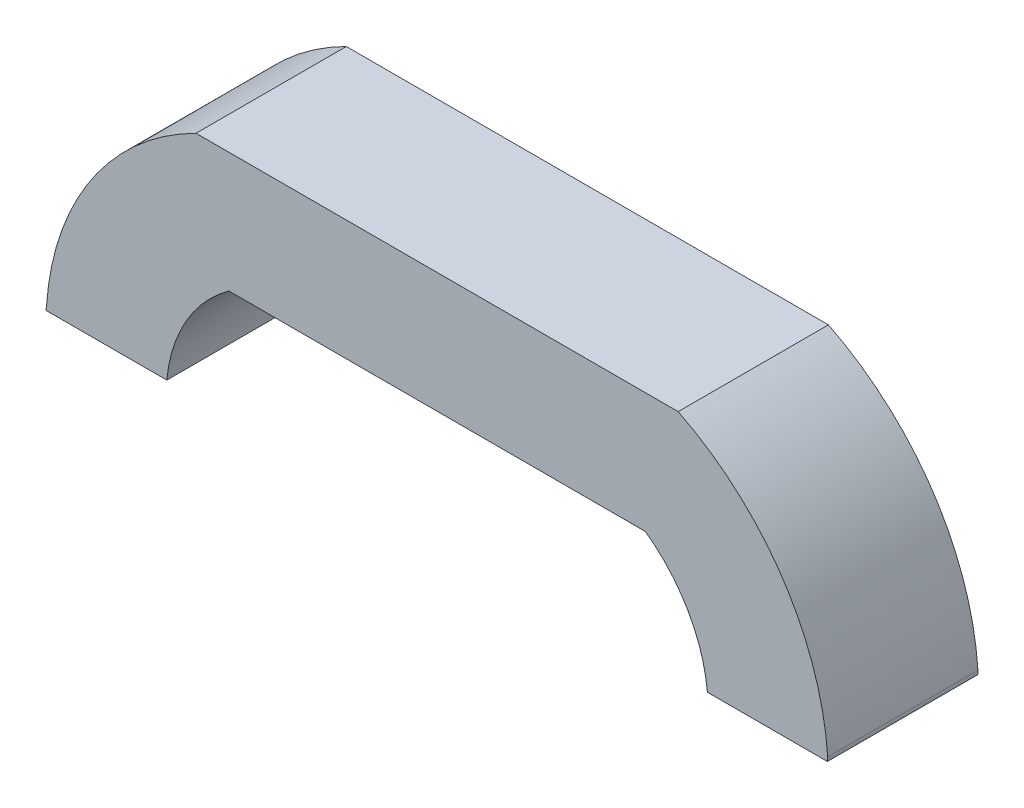
ISO-10303-21;
HEADER;
FILE_DESCRIPTION(('STEP AP214'),'2;1');
FILE_NAME('part.step','',(''),(''),'','','');
FILE_SCHEMA(('AUTOMOTIVE_DESIGN { 1 0 10303 214 1 1 1 1 }'));
ENDSEC;
DATA;
#1=APPLICATION_CONTEXT('core data for automotive mechanical design processes');
#2=APPLICATION_PROTOCOL_DEFINITION('international standard','automotive_design',2000,#1);
#3=PRODUCT_CONTEXT('',#1,'mechanical');
#4=PRODUCT('Part','Part','',(#3));
#5=PRODUCT_RELATED_PRODUCT_CATEGORY('part','',(#4));
#6=PRODUCT_DEFINITION_FORMATION('','',#4);
#7=PRODUCT_DEFINITION_CONTEXT('part definition',#1,'design');
#8=PRODUCT_DEFINITION('design','',#6,#7);
#9=PRODUCT_DEFINITION_SHAPE('','',#8);
#10=(LENGTH_UNIT() NAMED_UNIT(*) SI_UNIT(.MILLI.,.METRE.));
#11=(NAMED_UNIT(*) PLANE_ANGLE_UNIT() SI_UNIT($,.RADIAN.));
#12=(NAMED_UNIT(*) SI_UNIT($,.STERADIAN.) SOLID_ANGLE_UNIT());
#13=UNCERTAINTY_MEASURE_WITH_UNIT(LENGTH_MEASURE(1.E-05),#10,'distance_accuracy_value','');
#14=(GEOMETRIC_REPRESENTATION_CONTEXT(3) GLOBAL_UNCERTAINTY_ASSIGNED_CONTEXT((#13)) GLOBAL_UNIT_ASSIGNED_CONTEXT((#10,
#11,#12)) REPRESENTATION_CONTEXT('',''));
#15=CARTESIAN_POINT('',(0.,0.,0.));
#16=DIRECTION('',(0.,0.,1.));
#17=DIRECTION('',(1.,0.,0.));
#18=AXIS2_PLACEMENT_3D('',#15,#16,#17);
#19=CARTESIAN_POINT('',(63.0298841219028,0.472457439636551,25.));
#20=DIRECTION('',(0.,0.,-1.));
#21=DIRECTION('',(-1.,0.,0.));
#22=AXIS2_PLACEMENT_3D('',#19,#20,#21);
#23=CYLINDRICAL_SURFACE('',#22,1.95791401243348);
#24=CARTESIAN_POINT('',(63.0298841219028,0.472457439636551,0.));
#25=DIRECTION('',(0.,0.,1.));
#26=DIRECTION('',(1.,0.,0.));
#27=AXIS2_PLACEMENT_3D('',#24,#25,#26);
#28=CIRCLE('',#27,1.95791401243348);
#29=CARTESIAN_POINT('',(64.9770075097149,0.677732359484106,0.));
#30=VERTEX_POINT('',#29);
#31=CARTESIAN_POINT('',(64.92993971262,0.,0.));
#32=VERTEX_POINT('',#31);
#33=EDGE_CURVE('E144',#30,#32,#28,.F.);
#34=ORIENTED_EDGE('',*,*,#33,.F.);
#35=DIRECTION('',(0.,0.,-1.));
#36=VECTOR('',#35,1.);
#37=CARTESIAN_POINT('',(64.9770075097149,0.677732359484106,25.));
#38=LINE('',#37,#36);
#39=CARTESIAN_POINT('',(64.9770075097149,0.677732359484106,25.));
#40=VERTEX_POINT('',#39);
#41=EDGE_CURVE('E11',#40,#30,#38,.T.);
#42=ORIENTED_EDGE('',*,*,#41,.F.);
#43=CARTESIAN_POINT('',(63.0298841219028,0.472457439636551,25.));
#44=DIRECTION('',(0.,0.,1.));
#45=DIRECTION('',(1.,0.,0.));
#46=AXIS2_PLACEMENT_3D('',#43,#44,#45);
#47=CIRCLE('',#46,1.95791401243348);
#48=CARTESIAN_POINT('',(64.92993971262,0.,25.));
#49=VERTEX_POINT('',#48);
#50=EDGE_CURVE('E168',#40,#49,#47,.F.);
#51=ORIENTED_EDGE('',*,*,#50,.T.);
#52=DIRECTION('',(0.,0.,-1.));
#53=VECTOR('',#52,1.);
#54=CARTESIAN_POINT('',(64.92993971262,0.,25.));
#55=LINE('',#54,#53);
#56=EDGE_CURVE('E98',#49,#32,#55,.T.);
#57=ORIENTED_EDGE('',*,*,#56,.T.);
#58=EDGE_LOOP('',(#34,#42,#51,#57));
#59=FACE_BOUND('',#58,.T.);
#60=ADVANCED_FACE('F41',(#59),#23,.T.);
#61=CARTESIAN_POINT('',(19.9479785108818,-2.38106358097612,25.));
#62=DIRECTION('',(0.,0.,-1.));
#63=DIRECTION('',(-1.,0.,0.));
#64=AXIS2_PLACEMENT_3D('',#61,#62,#63);
#65=CYLINDRICAL_SURFACE('',#64,45.1328005466438);
#66=CARTESIAN_POINT('',(19.9479785108818,-2.38106358097612,0.));
#67=DIRECTION('',(0.,0.,1.));
#68=DIRECTION('',(1.,0.,0.));
#69=AXIS2_PLACEMENT_3D('',#66,#67,#68);
#70=CIRCLE('',#69,45.1328005466438);
#71=CARTESIAN_POINT('',(40.1058402340978,38.,0.));
#72=VERTEX_POINT('',#71);
#73=EDGE_CURVE('E147',#72,#30,#70,.F.);
#74=ORIENTED_EDGE('',*,*,#73,.F.);
#75=DIRECTION('',(0.,0.,-1.));
#76=VECTOR('',#75,1.);
#77=CARTESIAN_POINT('',(40.1058402340978,38.,25.));
#78=LINE('',#77,#76);
#79=CARTESIAN_POINT('',(40.1058402340978,38.,25.));
#80=VERTEX_POINT('',#79);
#81=EDGE_CURVE('E49',#80,#72,#78,.T.);
#82=ORIENTED_EDGE('',*,*,#81,.F.);
#83=CARTESIAN_POINT('',(19.9479785108818,-2.38106358097612,25.));
#84=DIRECTION('',(0.,0.,1.));
#85=DIRECTION('',(1.,0.,0.));
#86=AXIS2_PLACEMENT_3D('',#83,#84,#85);
#87=CIRCLE('',#86,45.1328005466438);
#88=EDGE_CURVE('E220',#80,#40,#87,.F.);
#89=ORIENTED_EDGE('',*,*,#88,.T.);
#90=ORIENTED_EDGE('',*,*,#41,.T.);
#91=EDGE_LOOP('',(#74,#82,#89,#90));
#92=FACE_BOUND('',#91,.T.);
#93=ADVANCED_FACE('F191',(#92),#65,.T.);
#94=CARTESIAN_POINT('',(0.,38.,25.));
#95=DIRECTION('',(0.,1.,0.));
#96=DIRECTION('',(0.,0.,1.));
#97=AXIS2_PLACEMENT_3D('',#94,#95,#96);
#98=PLANE('',#97);
#99=DIRECTION('',(1.,0.,0.));
#100=VECTOR('',#99,1.);
#101=CARTESIAN_POINT('',(0.,38.,0.));
#102=LINE('',#101,#100);
#103=CARTESIAN_POINT('',(-40.1058402340978,38.,0.));
#104=VERTEX_POINT('',#103);
#105=EDGE_CURVE('E151',#104,#72,#102,.T.);
#106=ORIENTED_EDGE('',*,*,#105,.F.);
#107=DIRECTION('',(0.,0.,-1.));
#108=VECTOR('',#107,1.);
#109=CARTESIAN_POINT('',(-40.1058402340978,38.,25.));
#110=LINE('',#109,#108);
#111=CARTESIAN_POINT('',(-40.1058402340978,38.,25.));
#112=VERTEX_POINT('',#111);
#113=EDGE_CURVE('E180',#112,#104,#110,.T.);
#114=ORIENTED_EDGE('',*,*,#113,.F.);
#115=DIRECTION('',(1.,0.,0.));
#116=VECTOR('',#115,1.);
#117=CARTESIAN_POINT('',(0.,38.,25.));
#118=LINE('',#117,#116);
#119=EDGE_CURVE('E187',#112,#80,#118,.T.);
#120=ORIENTED_EDGE('',*,*,#119,.T.);
#121=ORIENTED_EDGE('',*,*,#81,.T.);
#122=EDGE_LOOP('',(#106,#114,#120,#121));
#123=FACE_BOUND('',#122,.T.);
#124=ADVANCED_FACE('F185',(#123),#98,.T.);
#125=CARTESIAN_POINT('',(-19.9479785108818,-2.38106358097612,25.));
#126=DIRECTION('',(0.,0.,-1.));
#127=DIRECTION('',(-1.,0.,0.));
#128=AXIS2_PLACEMENT_3D('',#125,#126,#127);
#129=CYLINDRICAL_SURFACE('',#128,45.1328005466438);
#130=CARTESIAN_POINT('',(-19.9479785108818,-2.38106358097612,0.));
#131=DIRECTION('',(0.,0.,1.));
#132=DIRECTION('',(1.,0.,0.));
#133=AXIS2_PLACEMENT_3D('',#130,#131,#132);
#134=CIRCLE('',#133,45.1328005466438);
#135=CARTESIAN_POINT('',(-64.9770075097149,0.677732359484106,0.));
#136=VERTEX_POINT('',#135);
#137=EDGE_CURVE('E154',#104,#136,#134,.T.);
#138=ORIENTED_EDGE('',*,*,#137,.T.);
#139=DIRECTION('',(0.,0.,-1.));
#140=VECTOR('',#139,1.);
#141=CARTESIAN_POINT('',(-64.9770075097149,0.677732359484106,25.));
#142=LINE('',#141,#140);
#143=CARTESIAN_POINT('',(-64.9770075097149,0.677732359484106,25.));
#144=VERTEX_POINT('',#143);
#145=EDGE_CURVE('E177',#144,#136,#142,.T.);
#146=ORIENTED_EDGE('',*,*,#145,.F.);
#147=CARTESIAN_POINT('',(-19.9479785108818,-2.38106358097612,25.));
#148=DIRECTION('',(0.,0.,1.));
#149=DIRECTION('',(1.,0.,0.));
#150=AXIS2_PLACEMENT_3D('',#147,#148,#149);
#151=CIRCLE('',#150,45.1328005466438);
#152=EDGE_CURVE('E208',#112,#144,#151,.T.);
#153=ORIENTED_EDGE('',*,*,#152,.F.);
#154=ORIENTED_EDGE('',*,*,#113,.T.);
#155=EDGE_LOOP('',(#138,#146,#153,#154));
#156=FACE_BOUND('',#155,.T.);
#157=ADVANCED_FACE('F199',(#156),#129,.T.);
#158=CARTESIAN_POINT('',(-49.6941486143079,-1.61989693514792,25.));
#159=DIRECTION('',(0.,0.,-1.));
#160=DIRECTION('',(-1.,0.,0.));
#161=AXIS2_PLACEMENT_3D('',#158,#159,#160);
#162=CYLINDRICAL_SURFACE('',#161,15.4546069633774);
#163=CARTESIAN_POINT('',(-49.6941486143079,-1.61989693514792,0.));
#164=DIRECTION('',(0.,0.,1.));
#165=DIRECTION('',(1.,0.,0.));
#166=AXIS2_PLACEMENT_3D('',#163,#164,#165);
#167=CIRCLE('',#166,15.4546069633774);
#168=CARTESIAN_POINT('',(-65.063625193293,0.,0.));
#169=VERTEX_POINT('',#168);
#170=EDGE_CURVE('E156',#136,#169,#167,.T.);
#171=ORIENTED_EDGE('',*,*,#170,.T.);
#172=DIRECTION('',(0.,0.,-1.));
#173=VECTOR('',#172,1.);
#174=CARTESIAN_POINT('',(-65.063625193293,0.,25.));
#175=LINE('',#174,#173);
#176=CARTESIAN_POINT('',(-65.063625193293,0.,25.));
#177=VERTEX_POINT('',#176);
#178=EDGE_CURVE('E174',#177,#169,#175,.T.);
#179=ORIENTED_EDGE('',*,*,#178,.F.);
#180=CARTESIAN_POINT('',(-49.6941486143079,-1.61989693514792,25.));
#181=DIRECTION('',(0.,0.,1.));
#182=DIRECTION('',(1.,0.,0.));
#183=AXIS2_PLACEMENT_3D('',#180,#181,#182);
#184=CIRCLE('',#183,15.4546069633774);
#185=EDGE_CURVE('E205',#144,#177,#184,.T.);
#186=ORIENTED_EDGE('',*,*,#185,.F.);
#187=ORIENTED_EDGE('',*,*,#145,.T.);
#188=EDGE_LOOP('',(#171,#179,#186,#187));
#189=FACE_BOUND('',#188,.T.);
#190=ADVANCED_FACE('F203',(#189),#162,.T.);
#191=CARTESIAN_POINT('',(0.,0.,25.));
#192=DIRECTION('',(0.,1.,0.));
#193=DIRECTION('',(0.,0.,1.));
#194=AXIS2_PLACEMENT_3D('',#191,#192,#193);
#195=PLANE('',#194);
#196=CARTESIAN_POINT('',(-55.,0.,12.5));
#197=DIRECTION('',(0.,-1.,0.));
#198=DIRECTION('',(0.,0.,-1.));
#199=AXIS2_PLACEMENT_3D('',#196,#197,#198);
#200=CIRCLE('',#199,2.);
#201=CARTESIAN_POINT('',(-55.,0.,10.5));
#202=VERTEX_POINT('',#201);
#203=EDGE_CURVE('E230',#202,#202,#200,.T.);
#204=ORIENTED_EDGE('',*,*,#203,.F.);
#205=EDGE_LOOP('',(#204));
#206=FACE_BOUND('',#205,.T.);
#207=DIRECTION('',(1.,0.,0.));
#208=VECTOR('',#207,1.);
#209=CARTESIAN_POINT('',(0.,0.,0.));
#210=LINE('',#209,#208);
#211=CARTESIAN_POINT('',(-44.9677346955597,0.,0.));
#212=VERTEX_POINT('',#211);
#213=EDGE_CURVE('E158',#169,#212,#210,.T.);
#214=ORIENTED_EDGE('',*,*,#213,.T.);
#215=DIRECTION('',(0.,0.,-1.));
#216=VECTOR('',#215,1.);
#217=CARTESIAN_POINT('',(-44.9677346955597,0.,25.));
#218=LINE('',#217,#216);
#219=CARTESIAN_POINT('',(-44.9677346955597,0.,25.));
#220=VERTEX_POINT('',#219);
#221=EDGE_CURVE('E172',#220,#212,#218,.T.);
#222=ORIENTED_EDGE('',*,*,#221,.F.);
#223=DIRECTION('',(1.,0.,0.));
#224=VECTOR('',#223,1.);
#225=CARTESIAN_POINT('',(0.,0.,25.));
#226=LINE('',#225,#224);
#227=EDGE_CURVE('E207',#177,#220,#226,.T.);
#228=ORIENTED_EDGE('',*,*,#227,.F.);
#229=ORIENTED_EDGE('',*,*,#178,.T.);
#230=EDGE_LOOP('',(#214,#222,#228,#229));
#231=FACE_BOUND('',#230,.T.);
#232=ADVANCED_FACE('F245',(#206,#231),#195,.F.);
#233=CARTESIAN_POINT('',(-19.9479785108818,-2.38106358097612,25.));
#234=DIRECTION('',(0.,0.,-1.));
#235=DIRECTION('',(-1.,0.,0.));
#236=AXIS2_PLACEMENT_3D('',#233,#234,#235);
#237=CYLINDRICAL_SURFACE('',#236,25.1328005466438);
#238=CARTESIAN_POINT('',(-19.9479785108818,-2.38106358097612,0.));
#239=DIRECTION('',(0.,0.,1.));
#240=DIRECTION('',(1.,0.,0.));
#241=AXIS2_PLACEMENT_3D('',#238,#239,#240);
#242=CIRCLE('',#241,25.1328005466438);
#243=CARTESIAN_POINT('',(-34.6540966467322,18.,0.));
#244=VERTEX_POINT('',#243);
#245=EDGE_CURVE('E161',#244,#212,#242,.T.);
#246=ORIENTED_EDGE('',*,*,#245,.F.);
#247=DIRECTION('',(0.,0.,-1.));
#248=VECTOR('',#247,1.);
#249=CARTESIAN_POINT('',(-34.6540966467322,18.,25.));
#250=LINE('',#249,#248);
#251=CARTESIAN_POINT('',(-34.6540966467322,18.,25.));
#252=VERTEX_POINT('',#251);
#253=EDGE_CURVE('E136',#252,#244,#250,.T.);
#254=ORIENTED_EDGE('',*,*,#253,.F.);
#255=CARTESIAN_POINT('',(-19.9479785108818,-2.38106358097612,25.));
#256=DIRECTION('',(0.,0.,1.));
#257=DIRECTION('',(1.,0.,0.));
#258=AXIS2_PLACEMENT_3D('',#255,#256,#257);
#259=CIRCLE('',#258,25.1328005466438);
#260=EDGE_CURVE('E129',#252,#220,#259,.T.);
#261=ORIENTED_EDGE('',*,*,#260,.T.);
#262=ORIENTED_EDGE('',*,*,#221,.T.);
#263=EDGE_LOOP('',(#246,#254,#261,#262));
#264=FACE_BOUND('',#263,.T.);
#265=ADVANCED_FACE('F215',(#264),#237,.F.);
#266=CARTESIAN_POINT('',(0.,18.,25.));
#267=DIRECTION('',(0.,1.,0.));
#268=DIRECTION('',(0.,0.,1.));
#269=AXIS2_PLACEMENT_3D('',#266,#267,#268);
#270=PLANE('',#269);
#271=DIRECTION('',(1.,0.,0.));
#272=VECTOR('',#271,1.);
#273=CARTESIAN_POINT('',(0.,18.,0.));
#274=LINE('',#273,#272);
#275=CARTESIAN_POINT('',(34.6540966467322,18.,0.));
#276=VERTEX_POINT('',#275);
#277=EDGE_CURVE('E135',#244,#276,#274,.T.);
#278=ORIENTED_EDGE('',*,*,#277,.T.);
#279=DIRECTION('',(0.,0.,-1.));
#280=VECTOR('',#279,1.);
#281=CARTESIAN_POINT('',(34.6540966467322,18.,25.));
#282=LINE('',#281,#280);
#283=CARTESIAN_POINT('',(34.6540966467322,18.,25.));
#284=VERTEX_POINT('',#283);
#285=EDGE_CURVE('E132',#284,#276,#282,.T.);
#286=ORIENTED_EDGE('',*,*,#285,.F.);
#287=DIRECTION('',(1.,0.,0.));
#288=VECTOR('',#287,1.);
#289=CARTESIAN_POINT('',(0.,18.,25.));
#290=LINE('',#289,#288);
#291=EDGE_CURVE('E123',#252,#284,#290,.T.);
#292=ORIENTED_EDGE('',*,*,#291,.F.);
#293=ORIENTED_EDGE('',*,*,#253,.T.);
#294=EDGE_LOOP('',(#278,#286,#292,#293));
#295=FACE_BOUND('',#294,.T.);
#296=ADVANCED_FACE('F133',(#295),#270,.F.);
#297=CARTESIAN_POINT('',(19.9479785108818,-2.38106358097612,25.));
#298=DIRECTION('',(0.,0.,-1.));
#299=DIRECTION('',(-1.,0.,0.));
#300=AXIS2_PLACEMENT_3D('',#297,#298,#299);
#301=CYLINDRICAL_SURFACE('',#300,25.1328005466438);
#302=CARTESIAN_POINT('',(19.9479785108818,-2.38106358097612,0.));
#303=DIRECTION('',(0.,0.,1.));
#304=DIRECTION('',(1.,0.,0.));
#305=AXIS2_PLACEMENT_3D('',#302,#303,#304);
#306=CIRCLE('',#305,25.1328005466438);
#307=CARTESIAN_POINT('',(44.9677346955597,0.,0.));
#308=VERTEX_POINT('',#307);
#309=EDGE_CURVE('E91',#276,#308,#306,.F.);
#310=ORIENTED_EDGE('',*,*,#309,.T.);
#311=DIRECTION('',(0.,0.,-1.));
#312=VECTOR('',#311,1.);
#313=CARTESIAN_POINT('',(44.9677346955597,0.,25.));
#314=LINE('',#313,#312);
#315=CARTESIAN_POINT('',(44.9677346955597,0.,25.));
#316=VERTEX_POINT('',#315);
#317=EDGE_CURVE('E137',#316,#308,#314,.T.);
#318=ORIENTED_EDGE('',*,*,#317,.F.);
#319=CARTESIAN_POINT('',(19.9479785108818,-2.38106358097612,25.));
#320=DIRECTION('',(0.,0.,1.));
#321=DIRECTION('',(1.,0.,0.));
#322=AXIS2_PLACEMENT_3D('',#319,#320,#321);
#323=CIRCLE('',#322,25.1328005466438);
#324=EDGE_CURVE('E127',#284,#316,#323,.F.);
#325=ORIENTED_EDGE('',*,*,#324,.F.);
#326=ORIENTED_EDGE('',*,*,#285,.T.);
#327=EDGE_LOOP('',(#310,#318,#325,#326));
#328=FACE_BOUND('',#327,.T.);
#329=ADVANCED_FACE('F139',(#328),#301,.F.);
#330=CARTESIAN_POINT('',(0.,0.,25.));
#331=DIRECTION('',(0.,1.,0.));
#332=DIRECTION('',(0.,0.,1.));
#333=AXIS2_PLACEMENT_3D('',#330,#331,#332);
#334=PLANE('',#333);
#335=CARTESIAN_POINT('',(55.,0.,12.5));
#336=DIRECTION('',(0.,-1.,0.));
#337=DIRECTION('',(0.,0.,1.));
#338=AXIS2_PLACEMENT_3D('',#335,#336,#337);
#339=CIRCLE('',#338,2.);
#340=CARTESIAN_POINT('',(55.,0.,14.5));
#341=VERTEX_POINT('',#340);
#342=EDGE_CURVE('E224',#341,#341,#339,.T.);
#343=ORIENTED_EDGE('',*,*,#342,.F.);
#344=EDGE_LOOP('',(#343));
#345=FACE_BOUND('',#344,.T.);
#346=DIRECTION('',(1.,0.,0.));
#347=VECTOR('',#346,1.);
#348=CARTESIAN_POINT('',(0.,0.,0.));
#349=LINE('',#348,#347);
#350=EDGE_CURVE('E166',#308,#32,#349,.T.);
#351=ORIENTED_EDGE('',*,*,#350,.T.);
#352=ORIENTED_EDGE('',*,*,#56,.F.);
#353=DIRECTION('',(1.,0.,0.));
#354=VECTOR('',#353,1.);
#355=CARTESIAN_POINT('',(0.,0.,25.));
#356=LINE('',#355,#354);
#357=EDGE_CURVE('E57',#316,#49,#356,.T.);
#358=ORIENTED_EDGE('',*,*,#357,.F.);
#359=ORIENTED_EDGE('',*,*,#317,.T.);
#360=EDGE_LOOP('',(#351,#352,#358,#359));
#361=FACE_BOUND('',#360,.T.);
#362=ADVANCED_FACE('F219',(#345,#361),#334,.F.);
#363=CARTESIAN_POINT('',(0.,0.,25.));
#364=DIRECTION('',(0.,0.,1.));
#365=DIRECTION('',(1.,0.,0.));
#366=AXIS2_PLACEMENT_3D('',#363,#364,#365);
#367=PLANE('',#366);
#368=ORIENTED_EDGE('',*,*,#50,.F.);
#369=ORIENTED_EDGE('',*,*,#88,.F.);
#370=ORIENTED_EDGE('',*,*,#119,.F.);
#371=ORIENTED_EDGE('',*,*,#152,.T.);
#372=ORIENTED_EDGE('',*,*,#185,.T.);
#373=ORIENTED_EDGE('',*,*,#227,.T.);
#374=ORIENTED_EDGE('',*,*,#260,.F.);
#375=ORIENTED_EDGE('',*,*,#291,.T.);
#376=ORIENTED_EDGE('',*,*,#324,.T.);
#377=ORIENTED_EDGE('',*,*,#357,.T.);
#378=EDGE_LOOP('',(#368,#369,#370,#371,#372,#373,#374,#375,#376,#377));
#379=FACE_BOUND('',#378,.T.);
#380=ADVANCED_FACE('F125',(#379),#367,.T.);
#381=CARTESIAN_POINT('',(0.,0.,0.));
#382=DIRECTION('',(0.,0.,1.));
#383=DIRECTION('',(1.,0.,0.));
#384=AXIS2_PLACEMENT_3D('',#381,#382,#383);
#385=PLANE('',#384);
#386=ORIENTED_EDGE('',*,*,#33,.T.);
#387=ORIENTED_EDGE('',*,*,#350,.F.);
#388=ORIENTED_EDGE('',*,*,#309,.F.);
#389=ORIENTED_EDGE('',*,*,#277,.F.);
#390=ORIENTED_EDGE('',*,*,#245,.T.);
#391=ORIENTED_EDGE('',*,*,#213,.F.);
#392=ORIENTED_EDGE('',*,*,#170,.F.);
#393=ORIENTED_EDGE('',*,*,#137,.F.);
#394=ORIENTED_EDGE('',*,*,#105,.T.);
#395=ORIENTED_EDGE('',*,*,#73,.T.);
#396=EDGE_LOOP('',(#386,#387,#388,#389,#390,#391,#392,#393,#394,#395));
#397=FACE_BOUND('',#396,.T.);
#398=ADVANCED_FACE('F194',(#397),#385,.F.);
#399=CARTESIAN_POINT('',(55.,10.,12.5));
#400=DIRECTION('',(0.,-1.,0.));
#401=DIRECTION('',(0.,0.,-1.));
#402=AXIS2_PLACEMENT_3D('',#399,#400,#401);
#403=CYLINDRICAL_SURFACE('',#402,2.);
#404=CARTESIAN_POINT('',(55.,10.,12.5));
#405=DIRECTION('',(0.,-1.,0.));
#406=DIRECTION('',(0.,0.,1.));
#407=AXIS2_PLACEMENT_3D('',#404,#405,#406);
#408=CIRCLE('',#407,2.);
#409=CARTESIAN_POINT('',(55.,10.,14.5));
#410=VERTEX_POINT('',#409);
#411=EDGE_CURVE('E227',#410,#410,#408,.T.);
#412=ORIENTED_EDGE('',*,*,#411,.F.);
#413=EDGE_LOOP('',(#412));
#414=FACE_BOUND('',#413,.T.);
#415=ORIENTED_EDGE('',*,*,#342,.T.);
#416=EDGE_LOOP('',(#415));
#417=FACE_BOUND('',#416,.T.);
#418=ADVANCED_FACE('F320',(#414,#417),#403,.F.);
#419=CARTESIAN_POINT('',(55.,10.,12.5));
#420=DIRECTION('',(0.,1.,0.));
#421=DIRECTION('',(0.,0.,1.));
#422=AXIS2_PLACEMENT_3D('',#419,#420,#421);
#423=PLANE('',#422);
#424=ORIENTED_EDGE('',*,*,#411,.T.);
#425=EDGE_LOOP('',(#424));
#426=FACE_BOUND('',#425,.T.);
#427=ADVANCED_FACE('F241',(#426),#423,.F.);
#428=CARTESIAN_POINT('',(-55.,10.,12.5));
#429=DIRECTION('',(0.,-1.,0.));
#430=DIRECTION('',(0.,0.,-1.));
#431=AXIS2_PLACEMENT_3D('',#428,#429,#430);
#432=CYLINDRICAL_SURFACE('',#431,2.);
#433=CARTESIAN_POINT('',(-55.,10.,12.5));
#434=DIRECTION('',(0.,-1.,0.));
#435=DIRECTION('',(0.,0.,-1.));
#436=AXIS2_PLACEMENT_3D('',#433,#434,#435);
#437=CIRCLE('',#436,2.);
#438=CARTESIAN_POINT('',(-55.,10.,10.5));
#439=VERTEX_POINT('',#438);
#440=EDGE_CURVE('E148',#439,#439,#437,.T.);
#441=ORIENTED_EDGE('',*,*,#440,.F.);
#442=EDGE_LOOP('',(#441));
#443=FACE_BOUND('',#442,.T.);
#444=ORIENTED_EDGE('',*,*,#203,.T.);
#445=EDGE_LOOP('',(#444));
#446=FACE_BOUND('',#445,.T.);
#447=ADVANCED_FACE('F238',(#443,#446),#432,.F.);
#448=CARTESIAN_POINT('',(-55.,10.,12.5));
#449=DIRECTION('',(0.,-1.,0.));
#450=DIRECTION('',(0.,0.,-1.));
#451=AXIS2_PLACEMENT_3D('',#448,#449,#450);
#452=PLANE('',#451);
#453=ORIENTED_EDGE('',*,*,#440,.T.);
#454=EDGE_LOOP('',(#453));
#455=FACE_BOUND('',#454,.T.);
#456=ADVANCED_FACE('F236',(#455),#452,.T.);
#457=CLOSED_SHELL('',(#60,#93,#124,#157,#190,#232,#265,#296,#329,#362,#380,#398,#418,#427,#447,#456));
#458=MANIFOLD_SOLID_BREP('B2',#457);
#459=ADVANCED_BREP_SHAPE_REPRESENTATION('',(#18,#458),#14);
#460=SHAPE_DEFINITION_REPRESENTATION(#9,#459);
ENDSEC;
END-ISO-10303-21;
